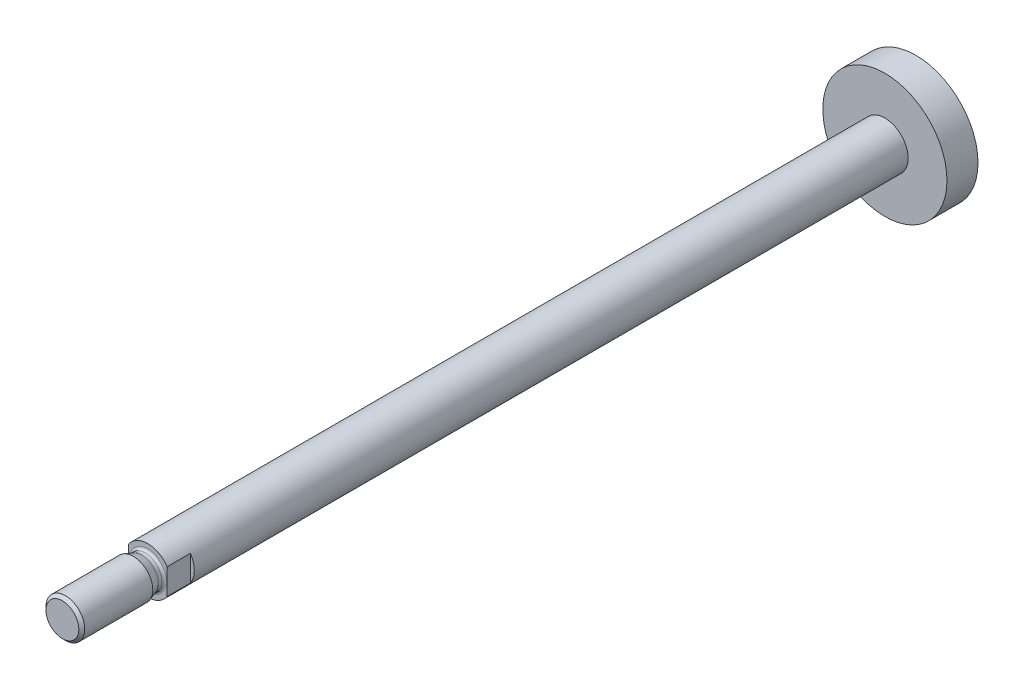
ISO-10303-21;
HEADER;
FILE_DESCRIPTION(('STEP AP214'),'2;1');
FILE_NAME('part.step','',(''),(''),'','','');
FILE_SCHEMA(('AUTOMOTIVE_DESIGN { 1 0 10303 214 1 1 1 1 }'));
ENDSEC;
DATA;
#1=APPLICATION_CONTEXT('core data for automotive mechanical design processes');
#2=APPLICATION_PROTOCOL_DEFINITION('international standard','automotive_design',2000,#1);
#3=PRODUCT_CONTEXT('',#1,'mechanical');
#4=PRODUCT('Part','Part','',(#3));
#5=PRODUCT_RELATED_PRODUCT_CATEGORY('part','',(#4));
#6=PRODUCT_DEFINITION_FORMATION('','',#4);
#7=PRODUCT_DEFINITION_CONTEXT('part definition',#1,'design');
#8=PRODUCT_DEFINITION('design','',#6,#7);
#9=PRODUCT_DEFINITION_SHAPE('','',#8);
#10=(LENGTH_UNIT() NAMED_UNIT(*) SI_UNIT(.MILLI.,.METRE.));
#11=(NAMED_UNIT(*) PLANE_ANGLE_UNIT() SI_UNIT($,.RADIAN.));
#12=(NAMED_UNIT(*) SI_UNIT($,.STERADIAN.) SOLID_ANGLE_UNIT());
#13=UNCERTAINTY_MEASURE_WITH_UNIT(LENGTH_MEASURE(1.E-05),#10,'distance_accuracy_value','');
#14=(GEOMETRIC_REPRESENTATION_CONTEXT(3) GLOBAL_UNCERTAINTY_ASSIGNED_CONTEXT((#13)) GLOBAL_UNIT_ASSIGNED_CONTEXT((#10,
#11,#12)) REPRESENTATION_CONTEXT('',''));
#15=CARTESIAN_POINT('',(0.,0.,0.));
#16=DIRECTION('',(0.,0.,1.));
#17=DIRECTION('',(1.,0.,0.));
#18=AXIS2_PLACEMENT_3D('',#15,#16,#17);
#19=CARTESIAN_POINT('',(0.,0.,8.));
#20=DIRECTION('',(0.,0.,-1.));
#21=DIRECTION('',(-1.,0.,0.));
#22=AXIS2_PLACEMENT_3D('',#19,#20,#21);
#23=PLANE('',#22);
#24=CARTESIAN_POINT('',(0.,0.,8.));
#25=DIRECTION('',(0.,0.,1.));
#26=DIRECTION('',(1.,0.,0.));
#27=AXIS2_PLACEMENT_3D('',#24,#25,#26);
#28=CIRCLE('',#27,4.8000000000001);
#29=CARTESIAN_POINT('',(4.8000000000001,0.,8.));
#30=VERTEX_POINT('',#29);
#31=EDGE_CURVE('E79',#30,#30,#28,.T.);
#32=ORIENTED_EDGE('',*,*,#31,.F.);
#33=EDGE_LOOP('',(#32));
#34=FACE_BOUND('',#33,.T.);
#35=DIRECTION('',(0.,1.,0.));
#36=VECTOR('',#35,1.);
#37=CARTESIAN_POINT('',(-5.,0.,8.));
#38=LINE('',#37,#36);
#39=CARTESIAN_POINT('',(-5.,-3.3166247903554,8.00000000000001));
#40=VERTEX_POINT('',#39);
#41=CARTESIAN_POINT('',(-5.,3.3166247903554,8.00000000000001));
#42=VERTEX_POINT('',#41);
#43=EDGE_CURVE('E100',#40,#42,#38,.T.);
#44=ORIENTED_EDGE('',*,*,#43,.F.);
#45=CARTESIAN_POINT('',(0.,0.,8.00000000000001));
#46=DIRECTION('',(0.,0.,1.));
#47=DIRECTION('',(1.,0.,0.));
#48=AXIS2_PLACEMENT_3D('',#45,#46,#47);
#49=CIRCLE('',#48,6.);
#50=CARTESIAN_POINT('',(5.,-3.3166247903554,8.00000000000001));
#51=VERTEX_POINT('',#50);
#52=EDGE_CURVE('E123',#40,#51,#49,.T.);
#53=ORIENTED_EDGE('',*,*,#52,.T.);
#54=DIRECTION('',(0.,-1.,0.));
#55=VECTOR('',#54,1.);
#56=CARTESIAN_POINT('',(5.,0.,8.));
#57=LINE('',#56,#55);
#58=CARTESIAN_POINT('',(5.,3.3166247903554,8.00000000000001));
#59=VERTEX_POINT('',#58);
#60=EDGE_CURVE('E86',#59,#51,#57,.T.);
#61=ORIENTED_EDGE('',*,*,#60,.F.);
#62=EDGE_CURVE('E93',#59,#42,#49,.T.);
#63=ORIENTED_EDGE('',*,*,#62,.T.);
#64=EDGE_LOOP('',(#44,#53,#61,#63));
#65=FACE_BOUND('',#64,.T.);
#66=ADVANCED_FACE('F36',(#34,#65),#23,.F.);
#67=CARTESIAN_POINT('',(0.,0.,-190.));
#68=DIRECTION('',(0.,0.,1.));
#69=DIRECTION('',(1.,0.,0.));
#70=AXIS2_PLACEMENT_3D('',#67,#68,#69);
#71=CYLINDRICAL_SURFACE('',#70,6.);
#72=CARTESIAN_POINT('',(0.,0.,-182.));
#73=DIRECTION('',(0.,0.,1.));
#74=DIRECTION('',(1.,0.,0.));
#75=AXIS2_PLACEMENT_3D('',#72,#73,#74);
#76=CIRCLE('',#75,6.);
#77=CARTESIAN_POINT('',(6.,0.,-182.));
#78=VERTEX_POINT('',#77);
#79=EDGE_CURVE('E126',#78,#78,#76,.T.);
#80=ORIENTED_EDGE('',*,*,#79,.T.);
#81=EDGE_LOOP('',(#80));
#82=FACE_BOUND('',#81,.T.);
#83=DIRECTION('',(0.,0.,1.));
#84=VECTOR('',#83,1.);
#85=CARTESIAN_POINT('',(-5.,-3.3166247903554,-190.));
#86=LINE('',#85,#84);
#87=CARTESIAN_POINT('',(-5.,-3.3166247903554,2.));
#88=VERTEX_POINT('',#87);
#89=EDGE_CURVE('E11',#88,#40,#86,.T.);
#90=ORIENTED_EDGE('',*,*,#89,.F.);
#91=CARTESIAN_POINT('',(0.,0.,2.));
#92=DIRECTION('',(0.,0.,1.));
#93=DIRECTION('',(1.,0.,0.));
#94=AXIS2_PLACEMENT_3D('',#91,#92,#93);
#95=CIRCLE('',#94,6.);
#96=CARTESIAN_POINT('',(-5.,3.3166247903554,2.));
#97=VERTEX_POINT('',#96);
#98=EDGE_CURVE('E81',#97,#88,#95,.T.);
#99=ORIENTED_EDGE('',*,*,#98,.F.);
#100=DIRECTION('',(0.,0.,1.));
#101=VECTOR('',#100,1.);
#102=CARTESIAN_POINT('',(-5.,3.3166247903554,-190.));
#103=LINE('',#102,#101);
#104=EDGE_CURVE('E43',#42,#97,#103,.F.);
#105=ORIENTED_EDGE('',*,*,#104,.F.);
#106=ORIENTED_EDGE('',*,*,#62,.F.);
#107=DIRECTION('',(0.,0.,1.));
#108=VECTOR('',#107,1.);
#109=CARTESIAN_POINT('',(5.,3.3166247903554,-190.));
#110=LINE('',#109,#108);
#111=CARTESIAN_POINT('',(5.,3.3166247903554,2.));
#112=VERTEX_POINT('',#111);
#113=EDGE_CURVE('E84',#112,#59,#110,.T.);
#114=ORIENTED_EDGE('',*,*,#113,.F.);
#115=CARTESIAN_POINT('',(5.,-3.3166247903554,2.));
#116=VERTEX_POINT('',#115);
#117=EDGE_CURVE('E73',#116,#112,#95,.T.);
#118=ORIENTED_EDGE('',*,*,#117,.F.);
#119=DIRECTION('',(0.,0.,1.));
#120=VECTOR('',#119,1.);
#121=CARTESIAN_POINT('',(5.,-3.3166247903554,-190.));
#122=LINE('',#121,#120);
#123=EDGE_CURVE('E78',#51,#116,#122,.F.);
#124=ORIENTED_EDGE('',*,*,#123,.F.);
#125=ORIENTED_EDGE('',*,*,#52,.F.);
#126=EDGE_LOOP('',(#90,#99,#105,#106,#114,#118,#124,#125));
#127=FACE_BOUND('',#126,.T.);
#128=ADVANCED_FACE('F90',(#82,#127),#71,.T.);
#129=CARTESIAN_POINT('',(0.,6.,-182.));
#130=DIRECTION('',(0.,0.,-1.));
#131=DIRECTION('',(-1.,0.,0.));
#132=AXIS2_PLACEMENT_3D('',#129,#130,#131);
#133=PLANE('',#132);
#134=ORIENTED_EDGE('',*,*,#79,.F.);
#135=EDGE_LOOP('',(#134));
#136=FACE_BOUND('',#135,.T.);
#137=CARTESIAN_POINT('',(0.,0.,-182.));
#138=DIRECTION('',(0.,0.,1.));
#139=DIRECTION('',(1.,0.,0.));
#140=AXIS2_PLACEMENT_3D('',#137,#138,#139);
#141=CIRCLE('',#140,16.);
#142=CARTESIAN_POINT('',(16.,0.,-182.));
#143=VERTEX_POINT('',#142);
#144=EDGE_CURVE('E129',#143,#143,#141,.T.);
#145=ORIENTED_EDGE('',*,*,#144,.T.);
#146=EDGE_LOOP('',(#145));
#147=FACE_BOUND('',#146,.T.);
#148=ADVANCED_FACE('F117',(#136,#147),#133,.F.);
#149=CARTESIAN_POINT('',(0.,0.,-190.));
#150=DIRECTION('',(0.,0.,1.));
#151=DIRECTION('',(1.,0.,0.));
#152=AXIS2_PLACEMENT_3D('',#149,#150,#151);
#153=CYLINDRICAL_SURFACE('',#152,16.);
#154=ORIENTED_EDGE('',*,*,#144,.F.);
#155=EDGE_LOOP('',(#154));
#156=FACE_BOUND('',#155,.T.);
#157=CARTESIAN_POINT('',(0.,0.,-190.));
#158=DIRECTION('',(0.,0.,1.));
#159=DIRECTION('',(1.,0.,0.));
#160=AXIS2_PLACEMENT_3D('',#157,#158,#159);
#161=CIRCLE('',#160,16.);
#162=CARTESIAN_POINT('',(16.,0.,-190.));
#163=VERTEX_POINT('',#162);
#164=EDGE_CURVE('E164',#163,#163,#161,.T.);
#165=ORIENTED_EDGE('',*,*,#164,.T.);
#166=EDGE_LOOP('',(#165));
#167=FACE_BOUND('',#166,.T.);
#168=ADVANCED_FACE('F147',(#156,#167),#153,.T.);
#169=CARTESIAN_POINT('',(0.,16.,-190.));
#170=DIRECTION('',(0.,0.,1.));
#171=DIRECTION('',(1.,0.,0.));
#172=AXIS2_PLACEMENT_3D('',#169,#170,#171);
#173=PLANE('',#172);
#174=ORIENTED_EDGE('',*,*,#164,.F.);
#175=EDGE_LOOP('',(#174));
#176=FACE_BOUND('',#175,.T.);
#177=ADVANCED_FACE('F137',(#176),#173,.F.);
#178=CARTESIAN_POINT('',(0.,0.,8.6000000000001));
#179=DIRECTION('',(0.,0.,1.));
#180=DIRECTION('',(1.,0.,0.));
#181=AXIS2_PLACEMENT_3D('',#178,#179,#180);
#182=TOROIDAL_SURFACE('',#181,4.8000000000001,0.600000000000098);
#183=CARTESIAN_POINT('',(0.,0.,8.6));
#184=DIRECTION('',(0.,0.,1.));
#185=DIRECTION('',(1.,0.,0.));
#186=AXIS2_PLACEMENT_3D('',#183,#184,#185);
#187=CIRCLE('',#186,4.2);
#188=CARTESIAN_POINT('',(4.2,0.,8.6));
#189=VERTEX_POINT('',#188);
#190=EDGE_CURVE('E166',#189,#189,#187,.T.);
#191=ORIENTED_EDGE('',*,*,#190,.F.);
#192=EDGE_LOOP('',(#191));
#193=FACE_BOUND('',#192,.T.);
#194=ORIENTED_EDGE('',*,*,#31,.T.);
#195=EDGE_LOOP('',(#194));
#196=FACE_BOUND('',#195,.T.);
#197=ADVANCED_FACE('F134',(#193,#196),#182,.F.);
#198=CARTESIAN_POINT('',(0.,0.,7.));
#199=DIRECTION('',(0.,0.,1.));
#200=DIRECTION('',(1.,0.,0.));
#201=AXIS2_PLACEMENT_3D('',#198,#199,#200);
#202=CYLINDRICAL_SURFACE('',#201,4.2);
#203=CARTESIAN_POINT('',(0.,0.,9.3942038115749));
#204=DIRECTION('',(0.,0.,1.));
#205=DIRECTION('',(1.,0.,0.));
#206=AXIS2_PLACEMENT_3D('',#203,#204,#205);
#207=CIRCLE('',#206,4.2);
#208=CARTESIAN_POINT('',(4.2,0.,9.3942038115749));
#209=VERTEX_POINT('',#208);
#210=EDGE_CURVE('E171',#209,#209,#207,.T.);
#211=ORIENTED_EDGE('',*,*,#210,.F.);
#212=EDGE_LOOP('',(#211));
#213=FACE_BOUND('',#212,.T.);
#214=ORIENTED_EDGE('',*,*,#190,.T.);
#215=EDGE_LOOP('',(#214));
#216=FACE_BOUND('',#215,.T.);
#217=ADVANCED_FACE('F136',(#213,#216),#202,.T.);
#218=CARTESIAN_POINT('',(0.,0.,9.39420381157482));
#219=DIRECTION('',(0.,0.,1.));
#220=DIRECTION('',(1.,0.,0.));
#221=AXIS2_PLACEMENT_3D('',#218,#219,#220);
#222=TOROIDAL_SURFACE('',#221,4.79999999999972,0.59999999999972);
#223=CARTESIAN_POINT('',(0.,0.,9.5994158975703));
#224=DIRECTION('',(0.,0.,1.));
#225=DIRECTION('',(1.,0.,0.));
#226=AXIS2_PLACEMENT_3D('',#223,#224,#225);
#227=CIRCLE('',#226,4.2361844275285);
#228=CARTESIAN_POINT('',(4.2361844275285,0.,9.5994158975703));
#229=VERTEX_POINT('',#228);
#230=EDGE_CURVE('E174',#229,#229,#227,.T.);
#231=ORIENTED_EDGE('',*,*,#230,.F.);
#232=EDGE_LOOP('',(#231));
#233=FACE_BOUND('',#232,.T.);
#234=ORIENTED_EDGE('',*,*,#210,.T.);
#235=EDGE_LOOP('',(#234));
#236=FACE_BOUND('',#235,.T.);
#237=ADVANCED_FACE('F144',(#233,#236),#222,.F.);
#238=CARTESIAN_POINT('',(0.,0.,9.5994158975703));
#239=DIRECTION('',(0.,0.,1.));
#240=DIRECTION('',(1.,0.,0.));
#241=AXIS2_PLACEMENT_3D('',#238,#239,#240);
#242=CONICAL_SURFACE('',#241,4.2361844275285,0.349065850398797);
#243=CARTESIAN_POINT('',(0.,0.,11.697981935564));
#244=DIRECTION('',(0.,0.,1.));
#245=DIRECTION('',(1.,0.,0.));
#246=AXIS2_PLACEMENT_3D('',#243,#244,#245);
#247=CIRCLE('',#246,5.);
#248=CARTESIAN_POINT('',(5.,0.,11.697981935564));
#249=VERTEX_POINT('',#248);
#250=EDGE_CURVE('E177',#249,#249,#247,.T.);
#251=ORIENTED_EDGE('',*,*,#250,.F.);
#252=EDGE_LOOP('',(#251));
#253=FACE_BOUND('',#252,.T.);
#254=ORIENTED_EDGE('',*,*,#230,.T.);
#255=EDGE_LOOP('',(#254));
#256=FACE_BOUND('',#255,.T.);
#257=ADVANCED_FACE('F198',(#253,#256),#242,.T.);
#258=CARTESIAN_POINT('',(0.,0.,7.));
#259=DIRECTION('',(0.,0.,1.));
#260=DIRECTION('',(1.,0.,0.));
#261=AXIS2_PLACEMENT_3D('',#258,#259,#260);
#262=CYLINDRICAL_SURFACE('',#261,5.);
#263=CARTESIAN_POINT('',(0.,0.,29.233));
#264=DIRECTION('',(0.,0.,1.));
#265=DIRECTION('',(1.,0.,0.));
#266=AXIS2_PLACEMENT_3D('',#263,#264,#265);
#267=CIRCLE('',#266,5.);
#268=CARTESIAN_POINT('',(5.,0.,29.233));
#269=VERTEX_POINT('',#268);
#270=EDGE_CURVE('E180',#269,#269,#267,.T.);
#271=ORIENTED_EDGE('',*,*,#270,.F.);
#272=EDGE_LOOP('',(#271));
#273=FACE_BOUND('',#272,.T.);
#274=ORIENTED_EDGE('',*,*,#250,.T.);
#275=EDGE_LOOP('',(#274));
#276=FACE_BOUND('',#275,.T.);
#277=ADVANCED_FACE('F192',(#273,#276),#262,.T.);
#278=CARTESIAN_POINT('',(0.,0.,29.233));
#279=DIRECTION('',(0.,0.,-1.));
#280=DIRECTION('',(-1.,0.,0.));
#281=AXIS2_PLACEMENT_3D('',#278,#279,#280);
#282=CONICAL_SURFACE('',#281,5.,0.785398163397451);
#283=CARTESIAN_POINT('',(0.,0.,30.));
#284=DIRECTION('',(0.,0.,1.));
#285=DIRECTION('',(1.,0.,0.));
#286=AXIS2_PLACEMENT_3D('',#283,#284,#285);
#287=CIRCLE('',#286,4.233);
#288=CARTESIAN_POINT('',(4.233,0.,30.));
#289=VERTEX_POINT('',#288);
#290=EDGE_CURVE('E124',#289,#289,#287,.T.);
#291=ORIENTED_EDGE('',*,*,#290,.F.);
#292=EDGE_LOOP('',(#291));
#293=FACE_BOUND('',#292,.T.);
#294=ORIENTED_EDGE('',*,*,#270,.T.);
#295=EDGE_LOOP('',(#294));
#296=FACE_BOUND('',#295,.T.);
#297=ADVANCED_FACE('F189',(#293,#296),#282,.T.);
#298=CARTESIAN_POINT('',(0.,0.,30.));
#299=DIRECTION('',(0.,0.,-1.));
#300=DIRECTION('',(-1.,0.,0.));
#301=AXIS2_PLACEMENT_3D('',#298,#299,#300);
#302=PLANE('',#301);
#303=ORIENTED_EDGE('',*,*,#290,.T.);
#304=EDGE_LOOP('',(#303));
#305=FACE_BOUND('',#304,.T.);
#306=ADVANCED_FACE('F111',(#305),#302,.F.);
#307=CARTESIAN_POINT('',(0.,0.,2.));
#308=DIRECTION('',(0.,0.,1.));
#309=DIRECTION('',(1.,0.,0.));
#310=AXIS2_PLACEMENT_3D('',#307,#308,#309);
#311=PLANE('',#310);
#312=ORIENTED_EDGE('',*,*,#117,.T.);
#313=DIRECTION('',(0.,-1.,0.));
#314=VECTOR('',#313,1.);
#315=CARTESIAN_POINT('',(5.,10.,2.));
#316=LINE('',#315,#314);
#317=EDGE_CURVE('E56',#112,#116,#316,.T.);
#318=ORIENTED_EDGE('',*,*,#317,.T.);
#319=EDGE_LOOP('',(#312,#318));
#320=FACE_BOUND('',#319,.T.);
#321=ADVANCED_FACE('F74',(#320),#311,.T.);
#322=CARTESIAN_POINT('',(5.,10.,9.));
#323=DIRECTION('',(1.,0.,0.));
#324=DIRECTION('',(0.,0.,-1.));
#325=AXIS2_PLACEMENT_3D('',#322,#323,#324);
#326=PLANE('',#325);
#327=ORIENTED_EDGE('',*,*,#113,.T.);
#328=ORIENTED_EDGE('',*,*,#60,.T.);
#329=ORIENTED_EDGE('',*,*,#123,.T.);
#330=ORIENTED_EDGE('',*,*,#317,.F.);
#331=EDGE_LOOP('',(#327,#328,#329,#330));
#332=FACE_BOUND('',#331,.T.);
#333=ADVANCED_FACE('F83',(#332),#326,.T.);
#334=CARTESIAN_POINT('',(-5.,-10.,9.));
#335=DIRECTION('',(-1.,0.,0.));
#336=DIRECTION('',(0.,0.,1.));
#337=AXIS2_PLACEMENT_3D('',#334,#335,#336);
#338=PLANE('',#337);
#339=ORIENTED_EDGE('',*,*,#89,.T.);
#340=ORIENTED_EDGE('',*,*,#43,.T.);
#341=ORIENTED_EDGE('',*,*,#104,.T.);
#342=DIRECTION('',(0.,1.,0.));
#343=VECTOR('',#342,1.);
#344=CARTESIAN_POINT('',(-5.,-10.,2.));
#345=LINE('',#344,#343);
#346=EDGE_CURVE('E49',#88,#97,#345,.T.);
#347=ORIENTED_EDGE('',*,*,#346,.F.);
#348=EDGE_LOOP('',(#339,#340,#341,#347));
#349=FACE_BOUND('',#348,.T.);
#350=ADVANCED_FACE('F98',(#349),#338,.T.);
#351=ORIENTED_EDGE('',*,*,#98,.T.);
#352=ORIENTED_EDGE('',*,*,#346,.T.);
#353=EDGE_LOOP('',(#351,#352));
#354=FACE_BOUND('',#353,.T.);
#355=ADVANCED_FACE('F102',(#354),#311,.T.);
#356=CLOSED_SHELL('',(#66,#128,#148,#168,#177,#197,#217,#237,#257,#277,#297,#306,#321,#333,#350,#355));
#357=MANIFOLD_SOLID_BREP('B2',#356);
#358=ADVANCED_BREP_SHAPE_REPRESENTATION('',(#18,#357),#14);
#359=SHAPE_DEFINITION_REPRESENTATION(#9,#358);
ENDSEC;
END-ISO-10303-21;
